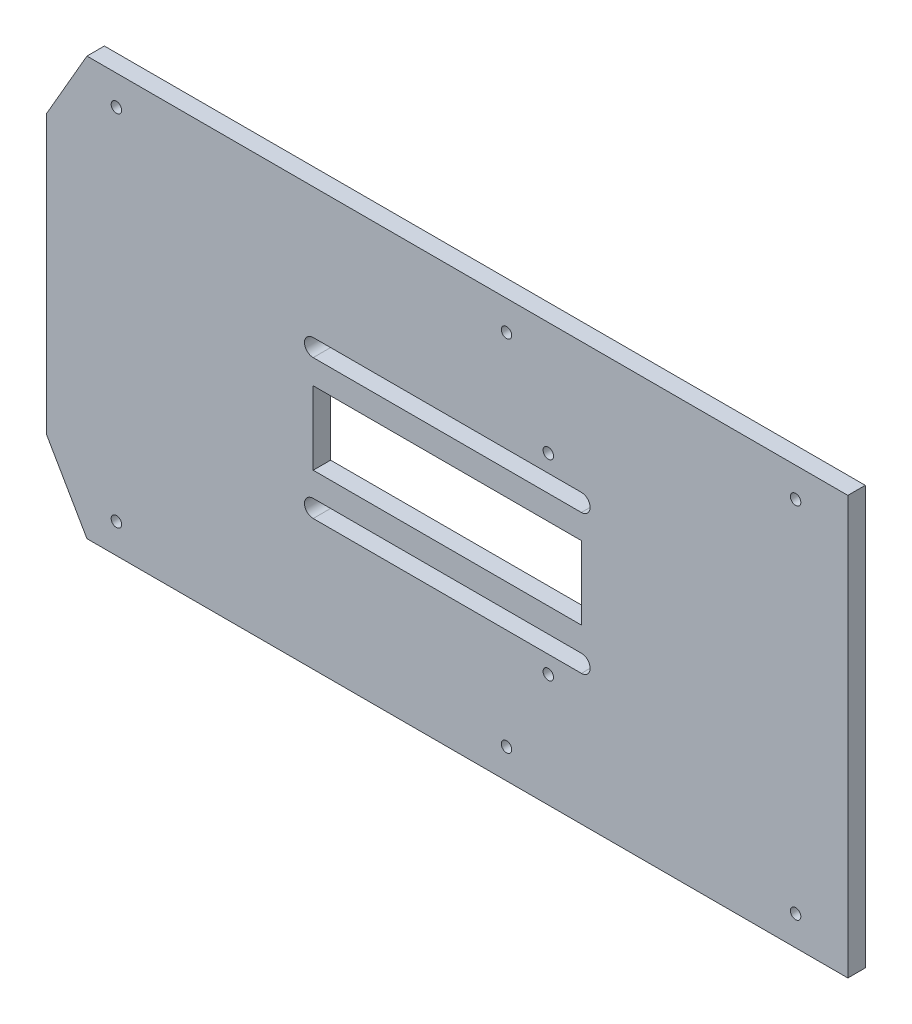
ISO-10303-21;
HEADER;
FILE_DESCRIPTION(('STEP AP214'),'2;1');
FILE_NAME('part.step','',(''),(''),'','','');
FILE_SCHEMA(('AUTOMOTIVE_DESIGN { 1 0 10303 214 1 1 1 1 }'));
ENDSEC;
DATA;
#1=APPLICATION_CONTEXT('core data for automotive mechanical design processes');
#2=APPLICATION_PROTOCOL_DEFINITION('international standard','automotive_design',2000,#1);
#3=PRODUCT_CONTEXT('',#1,'mechanical');
#4=PRODUCT('Part','Part','',(#3));
#5=PRODUCT_RELATED_PRODUCT_CATEGORY('part','',(#4));
#6=PRODUCT_DEFINITION_FORMATION('','',#4);
#7=PRODUCT_DEFINITION_CONTEXT('part definition',#1,'design');
#8=PRODUCT_DEFINITION('design','',#6,#7);
#9=PRODUCT_DEFINITION_SHAPE('','',#8);
#10=(LENGTH_UNIT() NAMED_UNIT(*) SI_UNIT(.MILLI.,.METRE.));
#11=(NAMED_UNIT(*) PLANE_ANGLE_UNIT() SI_UNIT($,.RADIAN.));
#12=(NAMED_UNIT(*) SI_UNIT($,.STERADIAN.) SOLID_ANGLE_UNIT());
#13=UNCERTAINTY_MEASURE_WITH_UNIT(LENGTH_MEASURE(1.E-05),#10,'distance_accuracy_value','');
#14=(GEOMETRIC_REPRESENTATION_CONTEXT(3) GLOBAL_UNCERTAINTY_ASSIGNED_CONTEXT((#13)) GLOBAL_UNIT_ASSIGNED_CONTEXT((#10,
#11,#12)) REPRESENTATION_CONTEXT('',''));
#15=CARTESIAN_POINT('',(0.,0.,0.));
#16=DIRECTION('',(0.,0.,1.));
#17=DIRECTION('',(1.,0.,0.));
#18=AXIS2_PLACEMENT_3D('',#15,#16,#17);
#19=CARTESIAN_POINT('',(0.,0.,5.));
#20=DIRECTION('',(0.,0.,1.));
#21=DIRECTION('',(1.,0.,0.));
#22=AXIS2_PLACEMENT_3D('',#19,#20,#21);
#23=PLANE('',#22);
#24=CARTESIAN_POINT('',(100.,-51.5,5.));
#25=DIRECTION('',(0.,0.,1.));
#26=DIRECTION('',(1.,0.,0.));
#27=AXIS2_PLACEMENT_3D('',#24,#25,#26);
#28=CIRCLE('',#27,1.5);
#29=CARTESIAN_POINT('',(101.5,-51.5,5.));
#30=VERTEX_POINT('',#29);
#31=EDGE_CURVE('E216',#30,#30,#28,.T.);
#32=ORIENTED_EDGE('',*,*,#31,.F.);
#33=EDGE_LOOP('',(#32));
#34=FACE_BOUND('',#33,.T.);
#35=CARTESIAN_POINT('',(17.,-51.5,5.));
#36=DIRECTION('',(0.,0.,1.));
#37=DIRECTION('',(1.,0.,0.));
#38=AXIS2_PLACEMENT_3D('',#35,#36,#37);
#39=CIRCLE('',#38,1.5);
#40=CARTESIAN_POINT('',(18.5,-51.5,5.));
#41=VERTEX_POINT('',#40);
#42=EDGE_CURVE('E217',#41,#41,#39,.T.);
#43=ORIENTED_EDGE('',*,*,#42,.F.);
#44=EDGE_LOOP('',(#43));
#45=FACE_BOUND('',#44,.T.);
#46=CARTESIAN_POINT('',(-95.,-51.5,5.));
#47=DIRECTION('',(0.,0.,1.));
#48=DIRECTION('',(1.,0.,0.));
#49=AXIS2_PLACEMENT_3D('',#46,#47,#48);
#50=CIRCLE('',#49,1.5);
#51=CARTESIAN_POINT('',(-93.5,-51.5,5.));
#52=VERTEX_POINT('',#51);
#53=EDGE_CURVE('E226',#52,#52,#50,.T.);
#54=ORIENTED_EDGE('',*,*,#53,.F.);
#55=EDGE_LOOP('',(#54));
#56=FACE_BOUND('',#55,.T.);
#57=CARTESIAN_POINT('',(29.,-27.5000000000001,5.));
#58=DIRECTION('',(0.,0.,1.));
#59=DIRECTION('',(1.,0.,0.));
#60=AXIS2_PLACEMENT_3D('',#57,#58,#59);
#61=CIRCLE('',#60,1.5);
#62=CARTESIAN_POINT('',(30.5,-27.5000000000001,5.));
#63=VERTEX_POINT('',#62);
#64=EDGE_CURVE('E234',#63,#63,#61,.T.);
#65=ORIENTED_EDGE('',*,*,#64,.F.);
#66=EDGE_LOOP('',(#65));
#67=FACE_BOUND('',#66,.T.);
#68=CARTESIAN_POINT('',(100.,51.5,5.));
#69=DIRECTION('',(0.,0.,1.));
#70=DIRECTION('',(1.,0.,0.));
#71=AXIS2_PLACEMENT_3D('',#68,#69,#70);
#72=CIRCLE('',#71,1.5);
#73=CARTESIAN_POINT('',(101.5,51.5,5.));
#74=VERTEX_POINT('',#73);
#75=EDGE_CURVE('E248',#74,#74,#72,.F.);
#76=ORIENTED_EDGE('',*,*,#75,.T.);
#77=EDGE_LOOP('',(#76));
#78=FACE_BOUND('',#77,.T.);
#79=CARTESIAN_POINT('',(17.,51.5,5.));
#80=DIRECTION('',(0.,0.,1.));
#81=DIRECTION('',(1.,0.,0.));
#82=AXIS2_PLACEMENT_3D('',#79,#80,#81);
#83=CIRCLE('',#82,1.5);
#84=CARTESIAN_POINT('',(18.5,51.5,5.));
#85=VERTEX_POINT('',#84);
#86=EDGE_CURVE('E249',#85,#85,#83,.F.);
#87=ORIENTED_EDGE('',*,*,#86,.T.);
#88=EDGE_LOOP('',(#87));
#89=FACE_BOUND('',#88,.T.);
#90=CARTESIAN_POINT('',(-95.,51.5,5.));
#91=DIRECTION('',(0.,0.,1.));
#92=DIRECTION('',(1.,0.,0.));
#93=AXIS2_PLACEMENT_3D('',#90,#91,#92);
#94=CIRCLE('',#93,1.5);
#95=CARTESIAN_POINT('',(-93.5,51.5,5.));
#96=VERTEX_POINT('',#95);
#97=EDGE_CURVE('E258',#96,#96,#94,.F.);
#98=ORIENTED_EDGE('',*,*,#97,.T.);
#99=EDGE_LOOP('',(#98));
#100=FACE_BOUND('',#99,.T.);
#101=CARTESIAN_POINT('',(29.,27.5000000000001,5.));
#102=DIRECTION('',(0.,0.,1.));
#103=DIRECTION('',(1.,0.,0.));
#104=AXIS2_PLACEMENT_3D('',#101,#102,#103);
#105=CIRCLE('',#104,1.5);
#106=CARTESIAN_POINT('',(30.5,27.5000000000001,5.));
#107=VERTEX_POINT('',#106);
#108=EDGE_CURVE('E266',#107,#107,#105,.F.);
#109=ORIENTED_EDGE('',*,*,#108,.T.);
#110=EDGE_LOOP('',(#109));
#111=FACE_BOUND('',#110,.T.);
#112=CARTESIAN_POINT('',(-38.5,20.,5.));
#113=DIRECTION('',(0.,0.,1.));
#114=DIRECTION('',(1.,0.,0.));
#115=AXIS2_PLACEMENT_3D('',#112,#113,#114);
#116=CIRCLE('',#115,2.5);
#117=CARTESIAN_POINT('',(-38.5,22.5,5.));
#118=VERTEX_POINT('',#117);
#119=CARTESIAN_POINT('',(-38.5,17.5,5.));
#120=VERTEX_POINT('',#119);
#121=EDGE_CURVE('E286',#118,#120,#116,.T.);
#122=ORIENTED_EDGE('',*,*,#121,.F.);
#123=DIRECTION('',(-1.,0.,0.));
#124=VECTOR('',#123,1.);
#125=CARTESIAN_POINT('',(-38.5,22.5,5.));
#126=LINE('',#125,#124);
#127=CARTESIAN_POINT('',(38.5,22.5,5.));
#128=VERTEX_POINT('',#127);
#129=EDGE_CURVE('E297',#128,#118,#126,.T.);
#130=ORIENTED_EDGE('',*,*,#129,.F.);
#131=CARTESIAN_POINT('',(38.5,20.,5.));
#132=DIRECTION('',(0.,0.,1.));
#133=DIRECTION('',(1.,0.,0.));
#134=AXIS2_PLACEMENT_3D('',#131,#132,#133);
#135=CIRCLE('',#134,2.5);
#136=CARTESIAN_POINT('',(38.5,17.5,5.));
#137=VERTEX_POINT('',#136);
#138=EDGE_CURVE('E293',#137,#128,#135,.T.);
#139=ORIENTED_EDGE('',*,*,#138,.F.);
#140=DIRECTION('',(1.,0.,0.));
#141=VECTOR('',#140,1.);
#142=CARTESIAN_POINT('',(-38.5,17.5,5.));
#143=LINE('',#142,#141);
#144=EDGE_CURVE('E289',#120,#137,#143,.T.);
#145=ORIENTED_EDGE('',*,*,#144,.F.);
#146=EDGE_LOOP('',(#122,#130,#139,#145));
#147=FACE_BOUND('',#146,.T.);
#148=DIRECTION('',(0.,1.,0.));
#149=VECTOR('',#148,1.);
#150=CARTESIAN_POINT('',(38.5,-10.5,5.));
#151=LINE('',#150,#149);
#152=CARTESIAN_POINT('',(38.5,-10.5,5.));
#153=VERTEX_POINT('',#152);
#154=CARTESIAN_POINT('',(38.5,10.5,5.));
#155=VERTEX_POINT('',#154);
#156=EDGE_CURVE('E329',#153,#155,#151,.T.);
#157=ORIENTED_EDGE('',*,*,#156,.F.);
#158=DIRECTION('',(1.,0.,0.));
#159=VECTOR('',#158,1.);
#160=CARTESIAN_POINT('',(-38.5,-10.5,5.));
#161=LINE('',#160,#159);
#162=CARTESIAN_POINT('',(-38.5,-10.5,5.));
#163=VERTEX_POINT('',#162);
#164=EDGE_CURVE('E340',#163,#153,#161,.T.);
#165=ORIENTED_EDGE('',*,*,#164,.F.);
#166=DIRECTION('',(0.,-1.,0.));
#167=VECTOR('',#166,1.);
#168=CARTESIAN_POINT('',(-38.5,-10.5,5.));
#169=LINE('',#168,#167);
#170=CARTESIAN_POINT('',(-38.5,10.5,5.));
#171=VERTEX_POINT('',#170);
#172=EDGE_CURVE('E336',#171,#163,#169,.T.);
#173=ORIENTED_EDGE('',*,*,#172,.F.);
#174=DIRECTION('',(-1.,0.,0.));
#175=VECTOR('',#174,1.);
#176=CARTESIAN_POINT('',(-38.5,10.5,5.));
#177=LINE('',#176,#175);
#178=EDGE_CURVE('E332',#155,#171,#177,.T.);
#179=ORIENTED_EDGE('',*,*,#178,.F.);
#180=EDGE_LOOP('',(#157,#165,#173,#179));
#181=FACE_BOUND('',#180,.T.);
#182=DIRECTION('',(0.,-1.,0.));
#183=VECTOR('',#182,1.);
#184=CARTESIAN_POINT('',(-115.,40.,5.));
#185=LINE('',#184,#183);
#186=CARTESIAN_POINT('',(-115.,40.,5.));
#187=VERTEX_POINT('',#186);
#188=CARTESIAN_POINT('',(-115.,-40.,5.));
#189=VERTEX_POINT('',#188);
#190=EDGE_CURVE('E389',#187,#189,#185,.T.);
#191=ORIENTED_EDGE('',*,*,#190,.T.);
#192=DIRECTION('',(-0.499999999999997,0.86602540378444,0.));
#193=VECTOR('',#192,1.);
#194=CARTESIAN_POINT('',(-103.452994616208,-60.,5.));
#195=LINE('',#194,#193);
#196=CARTESIAN_POINT('',(-103.452994616208,-60.,5.));
#197=VERTEX_POINT('',#196);
#198=EDGE_CURVE('E362',#197,#189,#195,.T.);
#199=ORIENTED_EDGE('',*,*,#198,.F.);
#200=DIRECTION('',(-1.,0.,0.));
#201=VECTOR('',#200,1.);
#202=CARTESIAN_POINT('',(115.,-60.,5.));
#203=LINE('',#202,#201);
#204=CARTESIAN_POINT('',(115.,-60.,5.));
#205=VERTEX_POINT('',#204);
#206=EDGE_CURVE('E366',#205,#197,#203,.T.);
#207=ORIENTED_EDGE('',*,*,#206,.F.);
#208=DIRECTION('',(0.,1.,0.));
#209=VECTOR('',#208,1.);
#210=CARTESIAN_POINT('',(115.,0.,5.));
#211=LINE('',#210,#209);
#212=CARTESIAN_POINT('',(115.,60.,5.));
#213=VERTEX_POINT('',#212);
#214=EDGE_CURVE('E392',#205,#213,#211,.T.);
#215=ORIENTED_EDGE('',*,*,#214,.T.);
#216=DIRECTION('',(-1.,0.,0.));
#217=VECTOR('',#216,1.);
#218=CARTESIAN_POINT('',(115.,60.,5.));
#219=LINE('',#218,#217);
#220=CARTESIAN_POINT('',(-103.452994616208,60.,5.));
#221=VERTEX_POINT('',#220);
#222=EDGE_CURVE('E396',#213,#221,#219,.T.);
#223=ORIENTED_EDGE('',*,*,#222,.T.);
#224=DIRECTION('',(-0.499999999999996,-0.866025403784441,0.));
#225=VECTOR('',#224,1.);
#226=CARTESIAN_POINT('',(-103.452994616208,60.,5.));
#227=LINE('',#226,#225);
#228=EDGE_CURVE('E399',#221,#187,#227,.T.);
#229=ORIENTED_EDGE('',*,*,#228,.T.);
#230=EDGE_LOOP('',(#191,#199,#207,#215,#223,#229));
#231=FACE_BOUND('',#230,.T.);
#232=DIRECTION('',(-1.,0.,0.));
#233=VECTOR('',#232,1.);
#234=CARTESIAN_POINT('',(-38.5,-22.5,5.));
#235=LINE('',#234,#233);
#236=CARTESIAN_POINT('',(38.5,-22.5,5.));
#237=VERTEX_POINT('',#236);
#238=CARTESIAN_POINT('',(-38.5,-22.5,5.));
#239=VERTEX_POINT('',#238);
#240=EDGE_CURVE('E190',#237,#239,#235,.T.);
#241=ORIENTED_EDGE('',*,*,#240,.T.);
#242=CARTESIAN_POINT('',(-38.5,-20.,5.));
#243=DIRECTION('',(0.,0.,-1.));
#244=DIRECTION('',(1.,0.,0.));
#245=AXIS2_PLACEMENT_3D('',#242,#243,#244);
#246=CIRCLE('',#245,2.5);
#247=CARTESIAN_POINT('',(-38.5,-17.5,5.));
#248=VERTEX_POINT('',#247);
#249=EDGE_CURVE('E57',#239,#248,#246,.T.);
#250=ORIENTED_EDGE('',*,*,#249,.T.);
#251=DIRECTION('',(1.,0.,0.));
#252=VECTOR('',#251,1.);
#253=CARTESIAN_POINT('',(-38.5,-17.5,5.));
#254=LINE('',#253,#252);
#255=CARTESIAN_POINT('',(38.5,-17.5,5.));
#256=VERTEX_POINT('',#255);
#257=EDGE_CURVE('E181',#248,#256,#254,.T.);
#258=ORIENTED_EDGE('',*,*,#257,.T.);
#259=CARTESIAN_POINT('',(38.5,-20.,5.));
#260=DIRECTION('',(0.,0.,-1.));
#261=DIRECTION('',(1.,0.,0.));
#262=AXIS2_PLACEMENT_3D('',#259,#260,#261);
#263=CIRCLE('',#262,2.5);
#264=EDGE_CURVE('E198',#256,#237,#263,.T.);
#265=ORIENTED_EDGE('',*,*,#264,.T.);
#266=EDGE_LOOP('',(#241,#250,#258,#265));
#267=FACE_BOUND('',#266,.T.);
#268=ADVANCED_FACE('F41',(#34,#45,#56,#67,#78,#89,#100,#111,#147,#181,#231,#267),#23,.T.);
#269=CARTESIAN_POINT('',(0.,0.,0.));
#270=DIRECTION('',(0.,0.,1.));
#271=DIRECTION('',(1.,0.,0.));
#272=AXIS2_PLACEMENT_3D('',#269,#270,#271);
#273=PLANE('',#272);
#274=DIRECTION('',(0.,-1.,0.));
#275=VECTOR('',#274,1.);
#276=CARTESIAN_POINT('',(-115.,40.,0.));
#277=LINE('',#276,#275);
#278=CARTESIAN_POINT('',(-115.,40.,0.));
#279=VERTEX_POINT('',#278);
#280=CARTESIAN_POINT('',(-115.,-40.,0.));
#281=VERTEX_POINT('',#280);
#282=EDGE_CURVE('E388',#279,#281,#277,.T.);
#283=ORIENTED_EDGE('',*,*,#282,.F.);
#284=DIRECTION('',(-0.499999999999996,-0.866025403784441,0.));
#285=VECTOR('',#284,1.);
#286=CARTESIAN_POINT('',(-103.452994616208,60.,0.));
#287=LINE('',#286,#285);
#288=CARTESIAN_POINT('',(-103.452994616208,60.,0.));
#289=VERTEX_POINT('',#288);
#290=EDGE_CURVE('E393',#289,#279,#287,.T.);
#291=ORIENTED_EDGE('',*,*,#290,.F.);
#292=DIRECTION('',(-1.,0.,0.));
#293=VECTOR('',#292,1.);
#294=CARTESIAN_POINT('',(115.,60.,0.));
#295=LINE('',#294,#293);
#296=CARTESIAN_POINT('',(115.,60.,0.));
#297=VERTEX_POINT('',#296);
#298=EDGE_CURVE('E408',#297,#289,#295,.T.);
#299=ORIENTED_EDGE('',*,*,#298,.F.);
#300=DIRECTION('',(0.,1.,0.));
#301=VECTOR('',#300,1.);
#302=CARTESIAN_POINT('',(115.,0.,0.));
#303=LINE('',#302,#301);
#304=CARTESIAN_POINT('',(115.,-60.,0.));
#305=VERTEX_POINT('',#304);
#306=EDGE_CURVE('E405',#305,#297,#303,.T.);
#307=ORIENTED_EDGE('',*,*,#306,.F.);
#308=DIRECTION('',(-1.,0.,0.));
#309=VECTOR('',#308,1.);
#310=CARTESIAN_POINT('',(115.,-60.,0.));
#311=LINE('',#310,#309);
#312=CARTESIAN_POINT('',(-103.452994616208,-60.,0.));
#313=VERTEX_POINT('',#312);
#314=EDGE_CURVE('E367',#305,#313,#311,.T.);
#315=ORIENTED_EDGE('',*,*,#314,.T.);
#316=DIRECTION('',(-0.499999999999997,0.86602540378444,0.));
#317=VECTOR('',#316,1.);
#318=CARTESIAN_POINT('',(-103.452994616208,-60.,0.));
#319=LINE('',#318,#317);
#320=EDGE_CURVE('E361',#313,#281,#319,.T.);
#321=ORIENTED_EDGE('',*,*,#320,.T.);
#322=EDGE_LOOP('',(#283,#291,#299,#307,#315,#321));
#323=FACE_BOUND('',#322,.T.);
#324=DIRECTION('',(-1.,0.,0.));
#325=VECTOR('',#324,1.);
#326=CARTESIAN_POINT('',(-38.5,-10.5,0.));
#327=LINE('',#326,#325);
#328=CARTESIAN_POINT('',(38.5,-10.5,0.));
#329=VERTEX_POINT('',#328);
#330=CARTESIAN_POINT('',(-38.5,-10.5,0.));
#331=VERTEX_POINT('',#330);
#332=EDGE_CURVE('E321',#329,#331,#327,.T.);
#333=ORIENTED_EDGE('',*,*,#332,.F.);
#334=DIRECTION('',(0.,-1.,0.));
#335=VECTOR('',#334,1.);
#336=CARTESIAN_POINT('',(38.5,-10.5,0.));
#337=LINE('',#336,#335);
#338=CARTESIAN_POINT('',(38.5,10.5,0.));
#339=VERTEX_POINT('',#338);
#340=EDGE_CURVE('E325',#339,#329,#337,.T.);
#341=ORIENTED_EDGE('',*,*,#340,.F.);
#342=DIRECTION('',(1.,0.,0.));
#343=VECTOR('',#342,1.);
#344=CARTESIAN_POINT('',(-38.5,10.5,0.));
#345=LINE('',#344,#343);
#346=CARTESIAN_POINT('',(-38.5,10.5,0.));
#347=VERTEX_POINT('',#346);
#348=EDGE_CURVE('E348',#347,#339,#345,.T.);
#349=ORIENTED_EDGE('',*,*,#348,.F.);
#350=DIRECTION('',(0.,1.,0.));
#351=VECTOR('',#350,1.);
#352=CARTESIAN_POINT('',(-38.5,-10.5,0.));
#353=LINE('',#352,#351);
#354=EDGE_CURVE('E318',#331,#347,#353,.T.);
#355=ORIENTED_EDGE('',*,*,#354,.F.);
#356=EDGE_LOOP('',(#333,#341,#349,#355));
#357=FACE_BOUND('',#356,.T.);
#358=DIRECTION('',(1.,0.,0.));
#359=VECTOR('',#358,1.);
#360=CARTESIAN_POINT('',(-38.5,22.5,0.));
#361=LINE('',#360,#359);
#362=CARTESIAN_POINT('',(-38.5,22.5,0.));
#363=VERTEX_POINT('',#362);
#364=CARTESIAN_POINT('',(38.5,22.5,0.));
#365=VERTEX_POINT('',#364);
#366=EDGE_CURVE('E278',#363,#365,#361,.T.);
#367=ORIENTED_EDGE('',*,*,#366,.F.);
#368=CARTESIAN_POINT('',(-38.5,20.,0.));
#369=DIRECTION('',(0.,0.,1.));
#370=DIRECTION('',(1.,0.,0.));
#371=AXIS2_PLACEMENT_3D('',#368,#369,#370);
#372=CIRCLE('',#371,2.5);
#373=CARTESIAN_POINT('',(-38.5,17.5,0.));
#374=VERTEX_POINT('',#373);
#375=EDGE_CURVE('E282',#374,#363,#372,.F.);
#376=ORIENTED_EDGE('',*,*,#375,.F.);
#377=DIRECTION('',(-1.,0.,0.));
#378=VECTOR('',#377,1.);
#379=CARTESIAN_POINT('',(-38.5,17.5,0.));
#380=LINE('',#379,#378);
#381=CARTESIAN_POINT('',(38.5,17.5,0.));
#382=VERTEX_POINT('',#381);
#383=EDGE_CURVE('E305',#382,#374,#380,.T.);
#384=ORIENTED_EDGE('',*,*,#383,.F.);
#385=CARTESIAN_POINT('',(38.5,20.,0.));
#386=DIRECTION('',(0.,0.,1.));
#387=DIRECTION('',(1.,0.,0.));
#388=AXIS2_PLACEMENT_3D('',#385,#386,#387);
#389=CIRCLE('',#388,2.5);
#390=EDGE_CURVE('E253',#365,#382,#389,.F.);
#391=ORIENTED_EDGE('',*,*,#390,.F.);
#392=EDGE_LOOP('',(#367,#376,#384,#391));
#393=FACE_BOUND('',#392,.T.);
#394=CARTESIAN_POINT('',(29.,27.5000000000001,0.));
#395=DIRECTION('',(0.,0.,-1.));
#396=DIRECTION('',(-1.,0.,0.));
#397=AXIS2_PLACEMENT_3D('',#394,#395,#396);
#398=CIRCLE('',#397,1.5);
#399=CARTESIAN_POINT('',(27.5,27.5000000000001,0.));
#400=VERTEX_POINT('',#399);
#401=EDGE_CURVE('E221',#400,#400,#398,.T.);
#402=ORIENTED_EDGE('',*,*,#401,.F.);
#403=EDGE_LOOP('',(#402));
#404=FACE_BOUND('',#403,.T.);
#405=CARTESIAN_POINT('',(-95.,51.5,0.));
#406=DIRECTION('',(0.,0.,-1.));
#407=DIRECTION('',(-1.,0.,0.));
#408=AXIS2_PLACEMENT_3D('',#405,#406,#407);
#409=CIRCLE('',#408,1.5);
#410=CARTESIAN_POINT('',(-96.5,51.5,0.));
#411=VERTEX_POINT('',#410);
#412=EDGE_CURVE('E262',#411,#411,#409,.T.);
#413=ORIENTED_EDGE('',*,*,#412,.F.);
#414=EDGE_LOOP('',(#413));
#415=FACE_BOUND('',#414,.T.);
#416=CARTESIAN_POINT('',(17.,51.5,0.));
#417=DIRECTION('',(0.,0.,-1.));
#418=DIRECTION('',(-1.,0.,0.));
#419=AXIS2_PLACEMENT_3D('',#416,#417,#418);
#420=CIRCLE('',#419,1.5);
#421=CARTESIAN_POINT('',(15.5,51.5,0.));
#422=VERTEX_POINT('',#421);
#423=EDGE_CURVE('E254',#422,#422,#420,.T.);
#424=ORIENTED_EDGE('',*,*,#423,.F.);
#425=EDGE_LOOP('',(#424));
#426=FACE_BOUND('',#425,.T.);
#427=CARTESIAN_POINT('',(100.,51.5,0.));
#428=DIRECTION('',(0.,0.,-1.));
#429=DIRECTION('',(-1.,0.,0.));
#430=AXIS2_PLACEMENT_3D('',#427,#428,#429);
#431=CIRCLE('',#430,1.5);
#432=CARTESIAN_POINT('',(98.5,51.5,0.));
#433=VERTEX_POINT('',#432);
#434=EDGE_CURVE('E244',#433,#433,#431,.T.);
#435=ORIENTED_EDGE('',*,*,#434,.F.);
#436=EDGE_LOOP('',(#435));
#437=FACE_BOUND('',#436,.T.);
#438=CARTESIAN_POINT('',(29.,-27.5000000000001,0.));
#439=DIRECTION('',(0.,0.,1.));
#440=DIRECTION('',(-1.,0.,0.));
#441=AXIS2_PLACEMENT_3D('',#438,#439,#440);
#442=CIRCLE('',#441,1.5);
#443=CARTESIAN_POINT('',(27.5,-27.5000000000001,0.));
#444=VERTEX_POINT('',#443);
#445=EDGE_CURVE('E174',#444,#444,#442,.T.);
#446=ORIENTED_EDGE('',*,*,#445,.T.);
#447=EDGE_LOOP('',(#446));
#448=FACE_BOUND('',#447,.T.);
#449=CARTESIAN_POINT('',(-95.,-51.5,0.));
#450=DIRECTION('',(0.,0.,1.));
#451=DIRECTION('',(-1.,0.,0.));
#452=AXIS2_PLACEMENT_3D('',#449,#450,#451);
#453=CIRCLE('',#452,1.5);
#454=CARTESIAN_POINT('',(-96.5,-51.5,0.));
#455=VERTEX_POINT('',#454);
#456=EDGE_CURVE('E230',#455,#455,#453,.T.);
#457=ORIENTED_EDGE('',*,*,#456,.T.);
#458=EDGE_LOOP('',(#457));
#459=FACE_BOUND('',#458,.T.);
#460=CARTESIAN_POINT('',(17.,-51.5,0.));
#461=DIRECTION('',(0.,0.,1.));
#462=DIRECTION('',(-1.,0.,0.));
#463=AXIS2_PLACEMENT_3D('',#460,#461,#462);
#464=CIRCLE('',#463,1.5);
#465=CARTESIAN_POINT('',(15.5,-51.5,0.));
#466=VERTEX_POINT('',#465);
#467=EDGE_CURVE('E222',#466,#466,#464,.T.);
#468=ORIENTED_EDGE('',*,*,#467,.T.);
#469=EDGE_LOOP('',(#468));
#470=FACE_BOUND('',#469,.T.);
#471=CARTESIAN_POINT('',(100.,-51.5,0.));
#472=DIRECTION('',(0.,0.,1.));
#473=DIRECTION('',(-1.,0.,0.));
#474=AXIS2_PLACEMENT_3D('',#471,#472,#473);
#475=CIRCLE('',#474,1.5);
#476=CARTESIAN_POINT('',(98.5,-51.5,0.));
#477=VERTEX_POINT('',#476);
#478=EDGE_CURVE('E212',#477,#477,#475,.T.);
#479=ORIENTED_EDGE('',*,*,#478,.T.);
#480=EDGE_LOOP('',(#479));
#481=FACE_BOUND('',#480,.T.);
#482=CARTESIAN_POINT('',(-38.5,-20.,0.));
#483=DIRECTION('',(0.,0.,1.));
#484=DIRECTION('',(1.,0.,0.));
#485=AXIS2_PLACEMENT_3D('',#482,#483,#484);
#486=CIRCLE('',#485,2.5);
#487=CARTESIAN_POINT('',(-38.5,-17.5,0.));
#488=VERTEX_POINT('',#487);
#489=CARTESIAN_POINT('',(-38.5,-22.5,0.));
#490=VERTEX_POINT('',#489);
#491=EDGE_CURVE('E178',#488,#490,#486,.T.);
#492=ORIENTED_EDGE('',*,*,#491,.T.);
#493=DIRECTION('',(1.,0.,0.));
#494=VECTOR('',#493,1.);
#495=CARTESIAN_POINT('',(-38.5,-22.5,0.));
#496=LINE('',#495,#494);
#497=CARTESIAN_POINT('',(38.5,-22.5,0.));
#498=VERTEX_POINT('',#497);
#499=EDGE_CURVE('E166',#490,#498,#496,.T.);
#500=ORIENTED_EDGE('',*,*,#499,.T.);
#501=CARTESIAN_POINT('',(38.5,-20.,0.));
#502=DIRECTION('',(0.,0.,1.));
#503=DIRECTION('',(1.,0.,0.));
#504=AXIS2_PLACEMENT_3D('',#501,#502,#503);
#505=CIRCLE('',#504,2.5);
#506=CARTESIAN_POINT('',(38.5,-17.5,0.));
#507=VERTEX_POINT('',#506);
#508=EDGE_CURVE('E192',#498,#507,#505,.T.);
#509=ORIENTED_EDGE('',*,*,#508,.T.);
#510=DIRECTION('',(-1.,0.,0.));
#511=VECTOR('',#510,1.);
#512=CARTESIAN_POINT('',(-38.5,-17.5,0.));
#513=LINE('',#512,#511);
#514=EDGE_CURVE('E185',#507,#488,#513,.T.);
#515=ORIENTED_EDGE('',*,*,#514,.T.);
#516=EDGE_LOOP('',(#492,#500,#509,#515));
#517=FACE_BOUND('',#516,.T.);
#518=ADVANCED_FACE('F184',(#323,#357,#393,#404,#415,#426,#437,#448,#459,#470,#481,#517),#273,.F.);
#519=CARTESIAN_POINT('',(-115.,40.,5.));
#520=DIRECTION('',(1.,0.,0.));
#521=DIRECTION('',(0.,0.,-1.));
#522=AXIS2_PLACEMENT_3D('',#519,#520,#521);
#523=PLANE('',#522);
#524=ORIENTED_EDGE('',*,*,#282,.T.);
#525=DIRECTION('',(0.,0.,-1.));
#526=VECTOR('',#525,1.);
#527=CARTESIAN_POINT('',(-115.,-40.,5.));
#528=LINE('',#527,#526);
#529=EDGE_CURVE('E384',#189,#281,#528,.T.);
#530=ORIENTED_EDGE('',*,*,#529,.F.);
#531=ORIENTED_EDGE('',*,*,#190,.F.);
#532=DIRECTION('',(0.,0.,-1.));
#533=VECTOR('',#532,1.);
#534=CARTESIAN_POINT('',(-115.,40.,5.));
#535=LINE('',#534,#533);
#536=EDGE_CURVE('E402',#187,#279,#535,.T.);
#537=ORIENTED_EDGE('',*,*,#536,.T.);
#538=EDGE_LOOP('',(#524,#530,#531,#537));
#539=FACE_BOUND('',#538,.T.);
#540=ADVANCED_FACE('F43',(#539),#523,.F.);
#541=CARTESIAN_POINT('',(115.,0.,5.));
#542=DIRECTION('',(-1.,0.,0.));
#543=DIRECTION('',(0.,-1.,0.));
#544=AXIS2_PLACEMENT_3D('',#541,#542,#543);
#545=PLANE('',#544);
#546=ORIENTED_EDGE('',*,*,#306,.T.);
#547=DIRECTION('',(0.,0.,-1.));
#548=VECTOR('',#547,1.);
#549=CARTESIAN_POINT('',(115.,60.,5.));
#550=LINE('',#549,#548);
#551=EDGE_CURVE('E11',#213,#297,#550,.T.);
#552=ORIENTED_EDGE('',*,*,#551,.F.);
#553=ORIENTED_EDGE('',*,*,#214,.F.);
#554=DIRECTION('',(0.,0.,-1.));
#555=VECTOR('',#554,1.);
#556=CARTESIAN_POINT('',(115.,-60.,5.));
#557=LINE('',#556,#555);
#558=EDGE_CURVE('E371',#205,#305,#557,.T.);
#559=ORIENTED_EDGE('',*,*,#558,.T.);
#560=EDGE_LOOP('',(#546,#552,#553,#559));
#561=FACE_BOUND('',#560,.T.);
#562=ADVANCED_FACE('F444',(#561),#545,.F.);
#563=CARTESIAN_POINT('',(115.,60.,5.));
#564=DIRECTION('',(0.,-1.,0.));
#565=DIRECTION('',(1.,0.,0.));
#566=AXIS2_PLACEMENT_3D('',#563,#564,#565);
#567=PLANE('',#566);
#568=ORIENTED_EDGE('',*,*,#298,.T.);
#569=DIRECTION('',(0.,0.,-1.));
#570=VECTOR('',#569,1.);
#571=CARTESIAN_POINT('',(-103.452994616208,60.,5.));
#572=LINE('',#571,#570);
#573=EDGE_CURVE('E50',#221,#289,#572,.T.);
#574=ORIENTED_EDGE('',*,*,#573,.F.);
#575=ORIENTED_EDGE('',*,*,#222,.F.);
#576=ORIENTED_EDGE('',*,*,#551,.T.);
#577=EDGE_LOOP('',(#568,#574,#575,#576));
#578=FACE_BOUND('',#577,.T.);
#579=ADVANCED_FACE('F446',(#578),#567,.F.);
#580=CARTESIAN_POINT('',(-103.452994616208,60.,5.));
#581=DIRECTION('',(0.866025403784441,-0.499999999999996,0.));
#582=DIRECTION('',(0.499999999999996,0.866025403784441,0.));
#583=AXIS2_PLACEMENT_3D('',#580,#581,#582);
#584=PLANE('',#583);
#585=ORIENTED_EDGE('',*,*,#290,.T.);
#586=ORIENTED_EDGE('',*,*,#536,.F.);
#587=ORIENTED_EDGE('',*,*,#228,.F.);
#588=ORIENTED_EDGE('',*,*,#573,.T.);
#589=EDGE_LOOP('',(#585,#586,#587,#588));
#590=FACE_BOUND('',#589,.T.);
#591=ADVANCED_FACE('F421',(#590),#584,.F.);
#592=CARTESIAN_POINT('',(-103.452994616208,-60.,5.));
#593=DIRECTION('',(-0.866025403784441,-0.499999999999997,0.));
#594=DIRECTION('',(0.499999999999997,-0.866025403784441,0.));
#595=AXIS2_PLACEMENT_3D('',#592,#593,#594);
#596=PLANE('',#595);
#597=ORIENTED_EDGE('',*,*,#320,.F.);
#598=DIRECTION('',(0.,0.,-1.));
#599=VECTOR('',#598,1.);
#600=CARTESIAN_POINT('',(-103.452994616208,-60.,5.));
#601=LINE('',#600,#599);
#602=EDGE_CURVE('E381',#197,#313,#601,.T.);
#603=ORIENTED_EDGE('',*,*,#602,.F.);
#604=ORIENTED_EDGE('',*,*,#198,.T.);
#605=ORIENTED_EDGE('',*,*,#529,.T.);
#606=EDGE_LOOP('',(#597,#603,#604,#605));
#607=FACE_BOUND('',#606,.T.);
#608=ADVANCED_FACE('F434',(#607),#596,.T.);
#609=CARTESIAN_POINT('',(115.,-60.,5.));
#610=DIRECTION('',(0.,-1.,0.));
#611=DIRECTION('',(1.,0.,0.));
#612=AXIS2_PLACEMENT_3D('',#609,#610,#611);
#613=PLANE('',#612);
#614=ORIENTED_EDGE('',*,*,#314,.F.);
#615=ORIENTED_EDGE('',*,*,#558,.F.);
#616=ORIENTED_EDGE('',*,*,#206,.T.);
#617=ORIENTED_EDGE('',*,*,#602,.T.);
#618=EDGE_LOOP('',(#614,#615,#616,#617));
#619=FACE_BOUND('',#618,.T.);
#620=ADVANCED_FACE('F442',(#619),#613,.T.);
#621=CARTESIAN_POINT('',(38.5,-10.5,-0.00100000000000013));
#622=DIRECTION('',(1.,0.,0.));
#623=DIRECTION('',(0.,0.,-1.));
#624=AXIS2_PLACEMENT_3D('',#621,#622,#623);
#625=PLANE('',#624);
#626=ORIENTED_EDGE('',*,*,#340,.T.);
#627=DIRECTION('',(0.,0.,1.));
#628=VECTOR('',#627,1.);
#629=CARTESIAN_POINT('',(38.5,-10.5,-0.00100000000000013));
#630=LINE('',#629,#628);
#631=EDGE_CURVE('E345',#329,#153,#630,.T.);
#632=ORIENTED_EDGE('',*,*,#631,.T.);
#633=ORIENTED_EDGE('',*,*,#156,.T.);
#634=DIRECTION('',(0.,0.,1.));
#635=VECTOR('',#634,1.);
#636=CARTESIAN_POINT('',(38.5,10.5,-0.00100000000000013));
#637=LINE('',#636,#635);
#638=EDGE_CURVE('E344',#339,#155,#637,.T.);
#639=ORIENTED_EDGE('',*,*,#638,.F.);
#640=EDGE_LOOP('',(#626,#632,#633,#639));
#641=FACE_BOUND('',#640,.T.);
#642=ADVANCED_FACE('F468',(#641),#625,.F.);
#643=CARTESIAN_POINT('',(-38.5,-10.5,-0.00100000000000013));
#644=DIRECTION('',(0.,-1.,0.));
#645=DIRECTION('',(0.,0.,-1.));
#646=AXIS2_PLACEMENT_3D('',#643,#644,#645);
#647=PLANE('',#646);
#648=ORIENTED_EDGE('',*,*,#332,.T.);
#649=DIRECTION('',(0.,0.,1.));
#650=VECTOR('',#649,1.);
#651=CARTESIAN_POINT('',(-38.5,-10.5,-0.00100000000000013));
#652=LINE('',#651,#650);
#653=EDGE_CURVE('E349',#331,#163,#652,.T.);
#654=ORIENTED_EDGE('',*,*,#653,.T.);
#655=ORIENTED_EDGE('',*,*,#164,.T.);
#656=ORIENTED_EDGE('',*,*,#631,.F.);
#657=EDGE_LOOP('',(#648,#654,#655,#656));
#658=FACE_BOUND('',#657,.T.);
#659=ADVANCED_FACE('F471',(#658),#647,.F.);
#660=CARTESIAN_POINT('',(-38.5,-10.5,-0.00100000000000013));
#661=DIRECTION('',(-1.,0.,0.));
#662=DIRECTION('',(0.,0.,1.));
#663=AXIS2_PLACEMENT_3D('',#660,#661,#662);
#664=PLANE('',#663);
#665=ORIENTED_EDGE('',*,*,#354,.T.);
#666=DIRECTION('',(0.,0.,1.));
#667=VECTOR('',#666,1.);
#668=CARTESIAN_POINT('',(-38.5,10.5,-0.00100000000000013));
#669=LINE('',#668,#667);
#670=EDGE_CURVE('E352',#347,#171,#669,.T.);
#671=ORIENTED_EDGE('',*,*,#670,.T.);
#672=ORIENTED_EDGE('',*,*,#172,.T.);
#673=ORIENTED_EDGE('',*,*,#653,.F.);
#674=EDGE_LOOP('',(#665,#671,#672,#673));
#675=FACE_BOUND('',#674,.T.);
#676=ADVANCED_FACE('F477',(#675),#664,.F.);
#677=CARTESIAN_POINT('',(-38.5,10.5,-0.00100000000000013));
#678=DIRECTION('',(0.,1.,0.));
#679=DIRECTION('',(0.,0.,1.));
#680=AXIS2_PLACEMENT_3D('',#677,#678,#679);
#681=PLANE('',#680);
#682=ORIENTED_EDGE('',*,*,#348,.T.);
#683=ORIENTED_EDGE('',*,*,#638,.T.);
#684=ORIENTED_EDGE('',*,*,#178,.T.);
#685=ORIENTED_EDGE('',*,*,#670,.F.);
#686=EDGE_LOOP('',(#682,#683,#684,#685));
#687=FACE_BOUND('',#686,.T.);
#688=ADVANCED_FACE('F473',(#687),#681,.F.);
#689=CARTESIAN_POINT('',(-38.5,20.,-0.00100000000000013));
#690=DIRECTION('',(0.,0.,1.));
#691=DIRECTION('',(1.,0.,0.));
#692=AXIS2_PLACEMENT_3D('',#689,#690,#691);
#693=CYLINDRICAL_SURFACE('',#692,2.5);
#694=ORIENTED_EDGE('',*,*,#375,.T.);
#695=DIRECTION('',(0.,0.,1.));
#696=VECTOR('',#695,1.);
#697=CARTESIAN_POINT('',(-38.5,22.5,-0.00100000000000013));
#698=LINE('',#697,#696);
#699=EDGE_CURVE('E302',#363,#118,#698,.T.);
#700=ORIENTED_EDGE('',*,*,#699,.T.);
#701=ORIENTED_EDGE('',*,*,#121,.T.);
#702=DIRECTION('',(0.,0.,1.));
#703=VECTOR('',#702,1.);
#704=CARTESIAN_POINT('',(-38.5,17.5,-0.00100000000000013));
#705=LINE('',#704,#703);
#706=EDGE_CURVE('E301',#374,#120,#705,.T.);
#707=ORIENTED_EDGE('',*,*,#706,.F.);
#708=EDGE_LOOP('',(#694,#700,#701,#707));
#709=FACE_BOUND('',#708,.T.);
#710=ADVANCED_FACE('F476',(#709),#693,.F.);
#711=CARTESIAN_POINT('',(-38.5,22.5,-0.00100000000000013));
#712=DIRECTION('',(0.,1.,0.));
#713=DIRECTION('',(0.,0.,1.));
#714=AXIS2_PLACEMENT_3D('',#711,#712,#713);
#715=PLANE('',#714);
#716=ORIENTED_EDGE('',*,*,#366,.T.);
#717=DIRECTION('',(0.,0.,1.));
#718=VECTOR('',#717,1.);
#719=CARTESIAN_POINT('',(38.5,22.5,-0.00100000000000013));
#720=LINE('',#719,#718);
#721=EDGE_CURVE('E306',#365,#128,#720,.T.);
#722=ORIENTED_EDGE('',*,*,#721,.T.);
#723=ORIENTED_EDGE('',*,*,#129,.T.);
#724=ORIENTED_EDGE('',*,*,#699,.F.);
#725=EDGE_LOOP('',(#716,#722,#723,#724));
#726=FACE_BOUND('',#725,.T.);
#727=ADVANCED_FACE('F487',(#726),#715,.F.);
#728=CARTESIAN_POINT('',(38.5,20.,-0.00100000000000013));
#729=DIRECTION('',(0.,0.,1.));
#730=DIRECTION('',(1.,0.,0.));
#731=AXIS2_PLACEMENT_3D('',#728,#729,#730);
#732=CYLINDRICAL_SURFACE('',#731,2.5);
#733=ORIENTED_EDGE('',*,*,#390,.T.);
#734=DIRECTION('',(0.,0.,1.));
#735=VECTOR('',#734,1.);
#736=CARTESIAN_POINT('',(38.5,17.5,-0.00100000000000013));
#737=LINE('',#736,#735);
#738=EDGE_CURVE('E309',#382,#137,#737,.T.);
#739=ORIENTED_EDGE('',*,*,#738,.T.);
#740=ORIENTED_EDGE('',*,*,#138,.T.);
#741=ORIENTED_EDGE('',*,*,#721,.F.);
#742=EDGE_LOOP('',(#733,#739,#740,#741));
#743=FACE_BOUND('',#742,.T.);
#744=ADVANCED_FACE('F493',(#743),#732,.F.);
#745=CARTESIAN_POINT('',(-38.5,17.5,-0.00100000000000013));
#746=DIRECTION('',(0.,-1.,0.));
#747=DIRECTION('',(0.,0.,-1.));
#748=AXIS2_PLACEMENT_3D('',#745,#746,#747);
#749=PLANE('',#748);
#750=ORIENTED_EDGE('',*,*,#383,.T.);
#751=ORIENTED_EDGE('',*,*,#706,.T.);
#752=ORIENTED_EDGE('',*,*,#144,.T.);
#753=ORIENTED_EDGE('',*,*,#738,.F.);
#754=EDGE_LOOP('',(#750,#751,#752,#753));
#755=FACE_BOUND('',#754,.T.);
#756=ADVANCED_FACE('F489',(#755),#749,.F.);
#757=CARTESIAN_POINT('',(29.,27.5000000000001,9.24264068711929));
#758=DIRECTION('',(0.,0.,-1.));
#759=DIRECTION('',(-1.,0.,0.));
#760=AXIS2_PLACEMENT_3D('',#757,#758,#759);
#761=CYLINDRICAL_SURFACE('',#760,1.5);
#762=ORIENTED_EDGE('',*,*,#401,.T.);
#763=EDGE_LOOP('',(#762));
#764=FACE_BOUND('',#763,.T.);
#765=ORIENTED_EDGE('',*,*,#108,.F.);
#766=EDGE_LOOP('',(#765));
#767=FACE_BOUND('',#766,.T.);
#768=ADVANCED_FACE('F492',(#764,#767),#761,.F.);
#769=CARTESIAN_POINT('',(-95.,51.5,9.24264068711929));
#770=DIRECTION('',(0.,0.,-1.));
#771=DIRECTION('',(-1.,0.,0.));
#772=AXIS2_PLACEMENT_3D('',#769,#770,#771);
#773=CYLINDRICAL_SURFACE('',#772,1.5);
#774=ORIENTED_EDGE('',*,*,#412,.T.);
#775=EDGE_LOOP('',(#774));
#776=FACE_BOUND('',#775,.T.);
#777=ORIENTED_EDGE('',*,*,#97,.F.);
#778=EDGE_LOOP('',(#777));
#779=FACE_BOUND('',#778,.T.);
#780=ADVANCED_FACE('F503',(#776,#779),#773,.F.);
#781=CARTESIAN_POINT('',(17.,51.5,9.24264068711929));
#782=DIRECTION('',(0.,0.,-1.));
#783=DIRECTION('',(-1.,0.,0.));
#784=AXIS2_PLACEMENT_3D('',#781,#782,#783);
#785=CYLINDRICAL_SURFACE('',#784,1.5);
#786=ORIENTED_EDGE('',*,*,#423,.T.);
#787=EDGE_LOOP('',(#786));
#788=FACE_BOUND('',#787,.T.);
#789=ORIENTED_EDGE('',*,*,#86,.F.);
#790=EDGE_LOOP('',(#789));
#791=FACE_BOUND('',#790,.T.);
#792=ADVANCED_FACE('F507',(#788,#791),#785,.F.);
#793=CARTESIAN_POINT('',(100.,51.5,9.24264068711929));
#794=DIRECTION('',(0.,0.,-1.));
#795=DIRECTION('',(-1.,0.,0.));
#796=AXIS2_PLACEMENT_3D('',#793,#794,#795);
#797=CYLINDRICAL_SURFACE('',#796,1.5);
#798=ORIENTED_EDGE('',*,*,#434,.T.);
#799=EDGE_LOOP('',(#798));
#800=FACE_BOUND('',#799,.T.);
#801=ORIENTED_EDGE('',*,*,#75,.F.);
#802=EDGE_LOOP('',(#801));
#803=FACE_BOUND('',#802,.T.);
#804=ADVANCED_FACE('F511',(#800,#803),#797,.F.);
#805=CARTESIAN_POINT('',(29.,-27.5000000000001,9.24264068711929));
#806=DIRECTION('',(0.,0.,-1.));
#807=DIRECTION('',(-1.,0.,0.));
#808=AXIS2_PLACEMENT_3D('',#805,#806,#807);
#809=CYLINDRICAL_SURFACE('',#808,1.5);
#810=ORIENTED_EDGE('',*,*,#445,.F.);
#811=EDGE_LOOP('',(#810));
#812=FACE_BOUND('',#811,.T.);
#813=ORIENTED_EDGE('',*,*,#64,.T.);
#814=EDGE_LOOP('',(#813));
#815=FACE_BOUND('',#814,.T.);
#816=ADVANCED_FACE('F515',(#812,#815),#809,.F.);
#817=CARTESIAN_POINT('',(-95.,-51.5,9.24264068711929));
#818=DIRECTION('',(0.,0.,-1.));
#819=DIRECTION('',(-1.,0.,0.));
#820=AXIS2_PLACEMENT_3D('',#817,#818,#819);
#821=CYLINDRICAL_SURFACE('',#820,1.5);
#822=ORIENTED_EDGE('',*,*,#456,.F.);
#823=EDGE_LOOP('',(#822));
#824=FACE_BOUND('',#823,.T.);
#825=ORIENTED_EDGE('',*,*,#53,.T.);
#826=EDGE_LOOP('',(#825));
#827=FACE_BOUND('',#826,.T.);
#828=ADVANCED_FACE('F519',(#824,#827),#821,.F.);
#829=CARTESIAN_POINT('',(17.,-51.5,9.24264068711929));
#830=DIRECTION('',(0.,0.,-1.));
#831=DIRECTION('',(-1.,0.,0.));
#832=AXIS2_PLACEMENT_3D('',#829,#830,#831);
#833=CYLINDRICAL_SURFACE('',#832,1.5);
#834=ORIENTED_EDGE('',*,*,#467,.F.);
#835=EDGE_LOOP('',(#834));
#836=FACE_BOUND('',#835,.T.);
#837=ORIENTED_EDGE('',*,*,#42,.T.);
#838=EDGE_LOOP('',(#837));
#839=FACE_BOUND('',#838,.T.);
#840=ADVANCED_FACE('F523',(#836,#839),#833,.F.);
#841=CARTESIAN_POINT('',(100.,-51.5,9.24264068711929));
#842=DIRECTION('',(0.,0.,-1.));
#843=DIRECTION('',(-1.,0.,0.));
#844=AXIS2_PLACEMENT_3D('',#841,#842,#843);
#845=CYLINDRICAL_SURFACE('',#844,1.5);
#846=ORIENTED_EDGE('',*,*,#478,.F.);
#847=EDGE_LOOP('',(#846));
#848=FACE_BOUND('',#847,.T.);
#849=ORIENTED_EDGE('',*,*,#31,.T.);
#850=EDGE_LOOP('',(#849));
#851=FACE_BOUND('',#850,.T.);
#852=ADVANCED_FACE('F527',(#848,#851),#845,.F.);
#853=CARTESIAN_POINT('',(-38.5,-20.,-0.00100000000000013));
#854=DIRECTION('',(0.,0.,1.));
#855=DIRECTION('',(1.,0.,0.));
#856=AXIS2_PLACEMENT_3D('',#853,#854,#855);
#857=CYLINDRICAL_SURFACE('',#856,2.5);
#858=DIRECTION('',(0.,0.,1.));
#859=VECTOR('',#858,1.);
#860=CARTESIAN_POINT('',(-38.5,-17.5,-0.00100000000000013));
#861=LINE('',#860,#859);
#862=EDGE_CURVE('E175',#488,#248,#861,.T.);
#863=ORIENTED_EDGE('',*,*,#862,.T.);
#864=ORIENTED_EDGE('',*,*,#249,.F.);
#865=DIRECTION('',(0.,0.,1.));
#866=VECTOR('',#865,1.);
#867=CARTESIAN_POINT('',(-38.5,-22.5,-0.00100000000000013));
#868=LINE('',#867,#866);
#869=EDGE_CURVE('E168',#490,#239,#868,.T.);
#870=ORIENTED_EDGE('',*,*,#869,.F.);
#871=ORIENTED_EDGE('',*,*,#491,.F.);
#872=EDGE_LOOP('',(#863,#864,#870,#871));
#873=FACE_BOUND('',#872,.T.);
#874=ADVANCED_FACE('F177',(#873),#857,.F.);
#875=CARTESIAN_POINT('',(-38.5,-17.5,-0.00100000000000013));
#876=DIRECTION('',(0.,-1.,0.));
#877=DIRECTION('',(0.,0.,-1.));
#878=AXIS2_PLACEMENT_3D('',#875,#876,#877);
#879=PLANE('',#878);
#880=DIRECTION('',(0.,0.,1.));
#881=VECTOR('',#880,1.);
#882=CARTESIAN_POINT('',(38.5,-17.5,-0.00100000000000013));
#883=LINE('',#882,#881);
#884=EDGE_CURVE('E207',#507,#256,#883,.T.);
#885=ORIENTED_EDGE('',*,*,#884,.T.);
#886=ORIENTED_EDGE('',*,*,#257,.F.);
#887=ORIENTED_EDGE('',*,*,#862,.F.);
#888=ORIENTED_EDGE('',*,*,#514,.F.);
#889=EDGE_LOOP('',(#885,#886,#887,#888));
#890=FACE_BOUND('',#889,.T.);
#891=ADVANCED_FACE('F534',(#890),#879,.T.);
#892=CARTESIAN_POINT('',(38.5,-20.,-0.00100000000000013));
#893=DIRECTION('',(0.,0.,1.));
#894=DIRECTION('',(1.,0.,0.));
#895=AXIS2_PLACEMENT_3D('',#892,#893,#894);
#896=CYLINDRICAL_SURFACE('',#895,2.5);
#897=DIRECTION('',(0.,0.,1.));
#898=VECTOR('',#897,1.);
#899=CARTESIAN_POINT('',(38.5,-22.5,-0.00100000000000013));
#900=LINE('',#899,#898);
#901=EDGE_CURVE('E65',#498,#237,#900,.T.);
#902=ORIENTED_EDGE('',*,*,#901,.T.);
#903=ORIENTED_EDGE('',*,*,#264,.F.);
#904=ORIENTED_EDGE('',*,*,#884,.F.);
#905=ORIENTED_EDGE('',*,*,#508,.F.);
#906=EDGE_LOOP('',(#902,#903,#904,#905));
#907=FACE_BOUND('',#906,.T.);
#908=ADVANCED_FACE('F537',(#907),#896,.F.);
#909=CARTESIAN_POINT('',(-38.5,-22.5,-0.00100000000000013));
#910=DIRECTION('',(0.,1.,0.));
#911=DIRECTION('',(0.,0.,1.));
#912=AXIS2_PLACEMENT_3D('',#909,#910,#911);
#913=PLANE('',#912);
#914=ORIENTED_EDGE('',*,*,#869,.T.);
#915=ORIENTED_EDGE('',*,*,#240,.F.);
#916=ORIENTED_EDGE('',*,*,#901,.F.);
#917=ORIENTED_EDGE('',*,*,#499,.F.);
#918=EDGE_LOOP('',(#914,#915,#916,#917));
#919=FACE_BOUND('',#918,.T.);
#920=ADVANCED_FACE('F167',(#919),#913,.T.);
#921=CLOSED_SHELL('',(#268,#518,#540,#562,#579,#591,#608,#620,#642,#659,#676,#688,#710,#727,
#744,#756,#768,#780,#792,#804,#816,#828,#840,#852,#874,#891,#908,#920));
#922=MANIFOLD_SOLID_BREP('B2',#921);
#923=ADVANCED_BREP_SHAPE_REPRESENTATION('',(#18,#922),#14);
#924=SHAPE_DEFINITION_REPRESENTATION(#9,#923);
ENDSEC;
END-ISO-10303-21;
